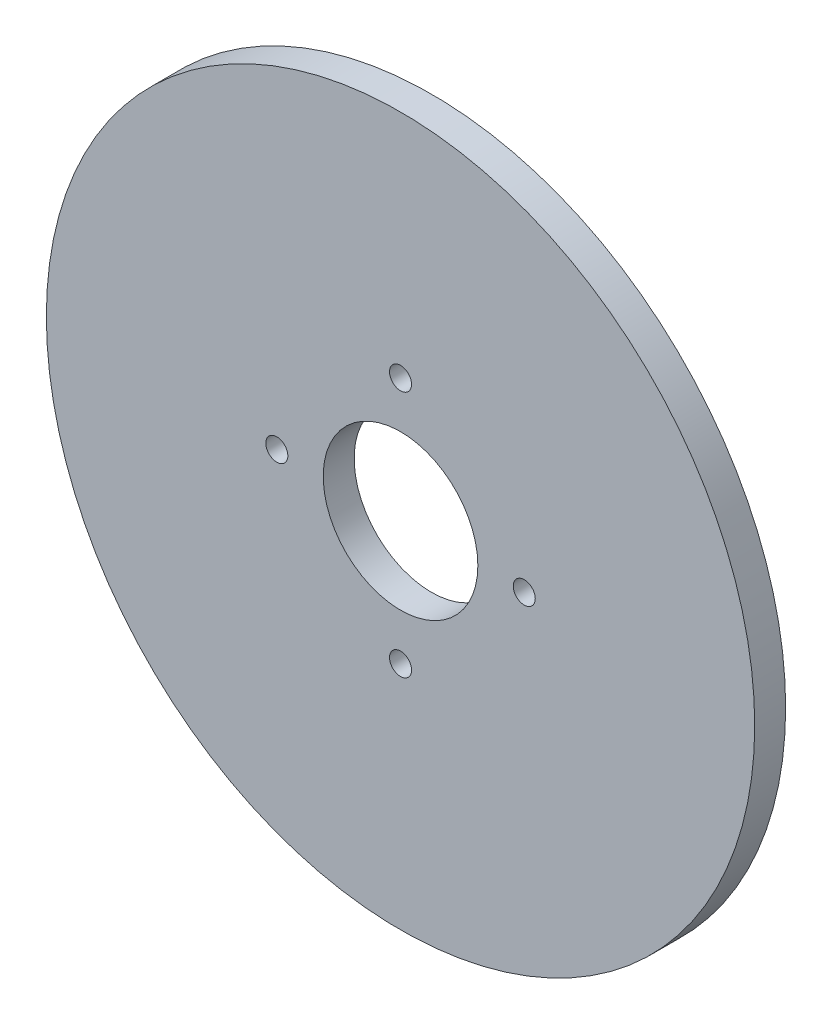
ISO-10303-21;
HEADER;
FILE_DESCRIPTION(('STEP AP214'),'2;1');
FILE_NAME('part.step','',(''),(''),'','','');
FILE_SCHEMA(('AUTOMOTIVE_DESIGN { 1 0 10303 214 1 1 1 1 }'));
ENDSEC;
DATA;
#1=APPLICATION_CONTEXT('core data for automotive mechanical design processes');
#2=APPLICATION_PROTOCOL_DEFINITION('international standard','automotive_design',2000,#1);
#3=PRODUCT_CONTEXT('',#1,'mechanical');
#4=PRODUCT('Part','Part','',(#3));
#5=PRODUCT_RELATED_PRODUCT_CATEGORY('part','',(#4));
#6=PRODUCT_DEFINITION_FORMATION('','',#4);
#7=PRODUCT_DEFINITION_CONTEXT('part definition',#1,'design');
#8=PRODUCT_DEFINITION('design','',#6,#7);
#9=PRODUCT_DEFINITION_SHAPE('','',#8);
#10=(LENGTH_UNIT() NAMED_UNIT(*) SI_UNIT(.MILLI.,.METRE.));
#11=(NAMED_UNIT(*) PLANE_ANGLE_UNIT() SI_UNIT($,.RADIAN.));
#12=(NAMED_UNIT(*) SI_UNIT($,.STERADIAN.) SOLID_ANGLE_UNIT());
#13=UNCERTAINTY_MEASURE_WITH_UNIT(LENGTH_MEASURE(1.E-05),#10,'distance_accuracy_value','');
#14=(GEOMETRIC_REPRESENTATION_CONTEXT(3) GLOBAL_UNCERTAINTY_ASSIGNED_CONTEXT((#13)) GLOBAL_UNIT_ASSIGNED_CONTEXT((#10,
#11,#12)) REPRESENTATION_CONTEXT('',''));
#15=CARTESIAN_POINT('',(0.,0.,0.));
#16=DIRECTION('',(0.,0.,1.));
#17=DIRECTION('',(1.,0.,0.));
#18=AXIS2_PLACEMENT_3D('',#15,#16,#17);
#19=CARTESIAN_POINT('',(0.,0.,3.175));
#20=DIRECTION('',(0.,0.,1.));
#21=DIRECTION('',(1.,0.,0.));
#22=AXIS2_PLACEMENT_3D('',#19,#20,#21);
#23=PLANE('',#22);
#24=CARTESIAN_POINT('',(0.,12.7,3.175));
#25=DIRECTION('',(0.,0.,1.));
#26=DIRECTION('',(1.,0.,0.));
#27=AXIS2_PLACEMENT_3D('',#24,#25,#26);
#28=CIRCLE('',#27,1.1303);
#29=CARTESIAN_POINT('',(1.1303,12.7,3.175));
#30=VERTEX_POINT('',#29);
#31=EDGE_CURVE('E63',#30,#30,#28,.T.);
#32=ORIENTED_EDGE('',*,*,#31,.F.);
#33=EDGE_LOOP('',(#32));
#34=FACE_BOUND('',#33,.T.);
#35=CARTESIAN_POINT('',(0.,-12.7,3.175));
#36=DIRECTION('',(0.,0.,1.));
#37=DIRECTION('',(1.,0.,0.));
#38=AXIS2_PLACEMENT_3D('',#35,#36,#37);
#39=CIRCLE('',#38,1.1303);
#40=CARTESIAN_POINT('',(1.1303,-12.7,3.175));
#41=VERTEX_POINT('',#40);
#42=EDGE_CURVE('E52',#41,#41,#39,.T.);
#43=ORIENTED_EDGE('',*,*,#42,.F.);
#44=EDGE_LOOP('',(#43));
#45=FACE_BOUND('',#44,.T.);
#46=CARTESIAN_POINT('',(12.7,0.,3.175));
#47=DIRECTION('',(0.,0.,1.));
#48=DIRECTION('',(1.,0.,0.));
#49=AXIS2_PLACEMENT_3D('',#46,#47,#48);
#50=CIRCLE('',#49,1.1303);
#51=CARTESIAN_POINT('',(13.8303,0.,3.175));
#52=VERTEX_POINT('',#51);
#53=EDGE_CURVE('E51',#52,#52,#50,.T.);
#54=ORIENTED_EDGE('',*,*,#53,.F.);
#55=EDGE_LOOP('',(#54));
#56=FACE_BOUND('',#55,.T.);
#57=CARTESIAN_POINT('',(-12.7,0.,3.175));
#58=DIRECTION('',(0.,0.,1.));
#59=DIRECTION('',(1.,0.,0.));
#60=AXIS2_PLACEMENT_3D('',#57,#58,#59);
#61=CIRCLE('',#60,1.1303);
#62=CARTESIAN_POINT('',(-11.5697,0.,3.175));
#63=VERTEX_POINT('',#62);
#64=EDGE_CURVE('E68',#63,#63,#61,.T.);
#65=ORIENTED_EDGE('',*,*,#64,.F.);
#66=EDGE_LOOP('',(#65));
#67=FACE_BOUND('',#66,.T.);
#68=CARTESIAN_POINT('',(0.,0.,3.175));
#69=DIRECTION('',(0.,0.,1.));
#70=DIRECTION('',(1.,0.,0.));
#71=AXIS2_PLACEMENT_3D('',#68,#69,#70);
#72=CIRCLE('',#71,36.3601);
#73=CARTESIAN_POINT('',(36.3601,0.,3.175));
#74=VERTEX_POINT('',#73);
#75=EDGE_CURVE('E10',#74,#74,#72,.T.);
#76=ORIENTED_EDGE('',*,*,#75,.T.);
#77=EDGE_LOOP('',(#76));
#78=FACE_BOUND('',#77,.T.);
#79=CARTESIAN_POINT('',(0.,0.,3.175));
#80=DIRECTION('',(0.,0.,1.));
#81=DIRECTION('',(1.,0.,0.));
#82=AXIS2_PLACEMENT_3D('',#79,#80,#81);
#83=CIRCLE('',#82,7.9375);
#84=CARTESIAN_POINT('',(7.9375,0.,3.175));
#85=VERTEX_POINT('',#84);
#86=EDGE_CURVE('E44',#85,#85,#83,.T.);
#87=ORIENTED_EDGE('',*,*,#86,.F.);
#88=EDGE_LOOP('',(#87));
#89=FACE_BOUND('',#88,.T.);
#90=ADVANCED_FACE('F31',(#34,#45,#56,#67,#78,#89),#23,.T.);
#91=CARTESIAN_POINT('',(0.,0.,0.));
#92=DIRECTION('',(0.,0.,1.));
#93=DIRECTION('',(1.,0.,0.));
#94=AXIS2_PLACEMENT_3D('',#91,#92,#93);
#95=PLANE('',#94);
#96=CARTESIAN_POINT('',(0.,12.7,0.));
#97=DIRECTION('',(0.,0.,1.));
#98=DIRECTION('',(1.,0.,0.));
#99=AXIS2_PLACEMENT_3D('',#96,#97,#98);
#100=CIRCLE('',#99,1.1303);
#101=CARTESIAN_POINT('',(1.1303,12.7,0.));
#102=VERTEX_POINT('',#101);
#103=EDGE_CURVE('E35',#102,#102,#100,.T.);
#104=ORIENTED_EDGE('',*,*,#103,.T.);
#105=EDGE_LOOP('',(#104));
#106=FACE_BOUND('',#105,.T.);
#107=CARTESIAN_POINT('',(0.,-12.7,0.));
#108=DIRECTION('',(0.,0.,1.));
#109=DIRECTION('',(1.,0.,0.));
#110=AXIS2_PLACEMENT_3D('',#107,#108,#109);
#111=CIRCLE('',#110,1.1303);
#112=CARTESIAN_POINT('',(1.1303,-12.7,0.));
#113=VERTEX_POINT('',#112);
#114=EDGE_CURVE('E49',#113,#113,#111,.T.);
#115=ORIENTED_EDGE('',*,*,#114,.T.);
#116=EDGE_LOOP('',(#115));
#117=FACE_BOUND('',#116,.T.);
#118=CARTESIAN_POINT('',(12.7,0.,0.));
#119=DIRECTION('',(0.,0.,1.));
#120=DIRECTION('',(1.,0.,0.));
#121=AXIS2_PLACEMENT_3D('',#118,#119,#120);
#122=CIRCLE('',#121,1.1303);
#123=CARTESIAN_POINT('',(13.8303,0.,0.));
#124=VERTEX_POINT('',#123);
#125=EDGE_CURVE('E56',#124,#124,#122,.T.);
#126=ORIENTED_EDGE('',*,*,#125,.T.);
#127=EDGE_LOOP('',(#126));
#128=FACE_BOUND('',#127,.T.);
#129=CARTESIAN_POINT('',(-12.7,0.,0.));
#130=DIRECTION('',(0.,0.,1.));
#131=DIRECTION('',(1.,0.,0.));
#132=AXIS2_PLACEMENT_3D('',#129,#130,#131);
#133=CIRCLE('',#132,1.1303);
#134=CARTESIAN_POINT('',(-11.5697,0.,0.));
#135=VERTEX_POINT('',#134);
#136=EDGE_CURVE('E71',#135,#135,#133,.T.);
#137=ORIENTED_EDGE('',*,*,#136,.T.);
#138=EDGE_LOOP('',(#137));
#139=FACE_BOUND('',#138,.T.);
#140=CARTESIAN_POINT('',(0.,0.,0.));
#141=DIRECTION('',(0.,0.,1.));
#142=DIRECTION('',(1.,0.,0.));
#143=AXIS2_PLACEMENT_3D('',#140,#141,#142);
#144=CIRCLE('',#143,36.3601);
#145=CARTESIAN_POINT('',(36.3601,0.,0.));
#146=VERTEX_POINT('',#145);
#147=EDGE_CURVE('E39',#146,#146,#144,.T.);
#148=ORIENTED_EDGE('',*,*,#147,.F.);
#149=EDGE_LOOP('',(#148));
#150=FACE_BOUND('',#149,.T.);
#151=CARTESIAN_POINT('',(0.,0.,0.));
#152=DIRECTION('',(0.,0.,1.));
#153=DIRECTION('',(1.,0.,0.));
#154=AXIS2_PLACEMENT_3D('',#151,#152,#153);
#155=CIRCLE('',#154,7.9375);
#156=CARTESIAN_POINT('',(7.9375,0.,0.));
#157=VERTEX_POINT('',#156);
#158=EDGE_CURVE('E47',#157,#157,#155,.T.);
#159=ORIENTED_EDGE('',*,*,#158,.T.);
#160=EDGE_LOOP('',(#159));
#161=FACE_BOUND('',#160,.T.);
#162=ADVANCED_FACE('F79',(#106,#117,#128,#139,#150,#161),#95,.F.);
#163=CARTESIAN_POINT('',(0.,0.,3.175));
#164=DIRECTION('',(0.,0.,-1.));
#165=DIRECTION('',(-1.,0.,0.));
#166=AXIS2_PLACEMENT_3D('',#163,#164,#165);
#167=CYLINDRICAL_SURFACE('',#166,36.3601);
#168=ORIENTED_EDGE('',*,*,#75,.F.);
#169=EDGE_LOOP('',(#168));
#170=FACE_BOUND('',#169,.T.);
#171=ORIENTED_EDGE('',*,*,#147,.T.);
#172=EDGE_LOOP('',(#171));
#173=FACE_BOUND('',#172,.T.);
#174=ADVANCED_FACE('F33',(#170,#173),#167,.T.);
#175=CARTESIAN_POINT('',(0.,0.,3.175));
#176=DIRECTION('',(0.,0.,-1.));
#177=DIRECTION('',(-1.,0.,0.));
#178=AXIS2_PLACEMENT_3D('',#175,#176,#177);
#179=CYLINDRICAL_SURFACE('',#178,7.9375);
#180=ORIENTED_EDGE('',*,*,#86,.T.);
#181=EDGE_LOOP('',(#180));
#182=FACE_BOUND('',#181,.T.);
#183=ORIENTED_EDGE('',*,*,#158,.F.);
#184=EDGE_LOOP('',(#183));
#185=FACE_BOUND('',#184,.T.);
#186=ADVANCED_FACE('F81',(#182,#185),#179,.F.);
#187=CARTESIAN_POINT('',(-12.7,0.,3.175));
#188=DIRECTION('',(0.,0.,1.));
#189=DIRECTION('',(1.,0.,0.));
#190=AXIS2_PLACEMENT_3D('',#187,#188,#189);
#191=CYLINDRICAL_SURFACE('',#190,1.1303);
#192=ORIENTED_EDGE('',*,*,#64,.T.);
#193=EDGE_LOOP('',(#192));
#194=FACE_BOUND('',#193,.T.);
#195=ORIENTED_EDGE('',*,*,#136,.F.);
#196=EDGE_LOOP('',(#195));
#197=FACE_BOUND('',#196,.T.);
#198=ADVANCED_FACE('F83',(#194,#197),#191,.F.);
#199=CARTESIAN_POINT('',(12.7,0.,3.175));
#200=DIRECTION('',(0.,0.,1.));
#201=DIRECTION('',(1.,0.,0.));
#202=AXIS2_PLACEMENT_3D('',#199,#200,#201);
#203=CYLINDRICAL_SURFACE('',#202,1.1303);
#204=ORIENTED_EDGE('',*,*,#53,.T.);
#205=EDGE_LOOP('',(#204));
#206=FACE_BOUND('',#205,.T.);
#207=ORIENTED_EDGE('',*,*,#125,.F.);
#208=EDGE_LOOP('',(#207));
#209=FACE_BOUND('',#208,.T.);
#210=ADVANCED_FACE('F89',(#206,#209),#203,.F.);
#211=CARTESIAN_POINT('',(0.,-12.7,3.175));
#212=DIRECTION('',(0.,0.,1.));
#213=DIRECTION('',(1.,0.,0.));
#214=AXIS2_PLACEMENT_3D('',#211,#212,#213);
#215=CYLINDRICAL_SURFACE('',#214,1.1303);
#216=ORIENTED_EDGE('',*,*,#42,.T.);
#217=EDGE_LOOP('',(#216));
#218=FACE_BOUND('',#217,.T.);
#219=ORIENTED_EDGE('',*,*,#114,.F.);
#220=EDGE_LOOP('',(#219));
#221=FACE_BOUND('',#220,.T.);
#222=ADVANCED_FACE('F117',(#218,#221),#215,.F.);
#223=CARTESIAN_POINT('',(0.,12.7,3.175));
#224=DIRECTION('',(0.,0.,1.));
#225=DIRECTION('',(1.,0.,0.));
#226=AXIS2_PLACEMENT_3D('',#223,#224,#225);
#227=CYLINDRICAL_SURFACE('',#226,1.1303);
#228=ORIENTED_EDGE('',*,*,#31,.T.);
#229=EDGE_LOOP('',(#228));
#230=FACE_BOUND('',#229,.T.);
#231=ORIENTED_EDGE('',*,*,#103,.F.);
#232=EDGE_LOOP('',(#231));
#233=FACE_BOUND('',#232,.T.);
#234=ADVANCED_FACE('F124',(#230,#233),#227,.F.);
#235=CLOSED_SHELL('',(#90,#162,#174,#186,#198,#210,#222,#234));
#236=MANIFOLD_SOLID_BREP('B2',#235);
#237=ADVANCED_BREP_SHAPE_REPRESENTATION('',(#18,#236),#14);
#238=SHAPE_DEFINITION_REPRESENTATION(#9,#237);
ENDSEC;
END-ISO-10303-21;
